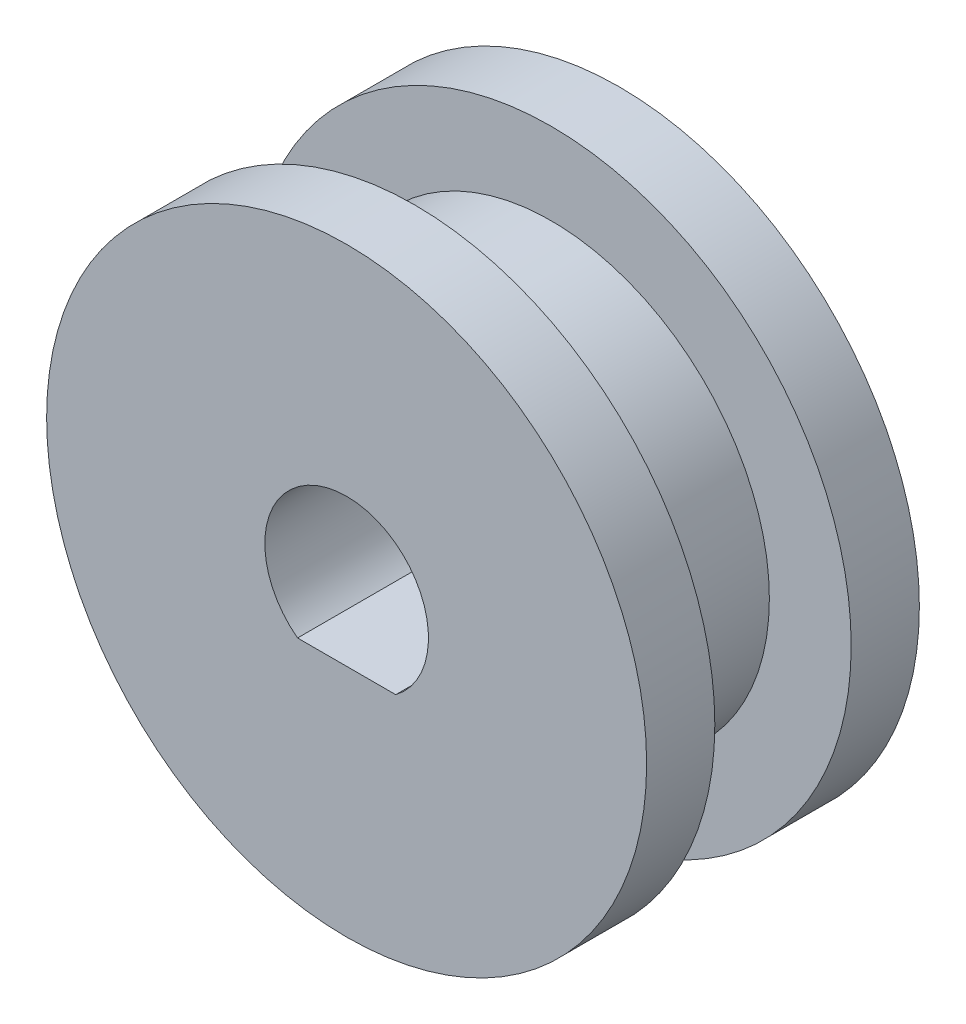
ISO-10303-21;
HEADER;
FILE_DESCRIPTION(('STEP AP214'),'2;1');
FILE_NAME('part.step','',(''),(''),'','','');
FILE_SCHEMA(('AUTOMOTIVE_DESIGN { 1 0 10303 214 1 1 1 1 }'));
ENDSEC;
DATA;
#1=APPLICATION_CONTEXT('core data for automotive mechanical design processes');
#2=APPLICATION_PROTOCOL_DEFINITION('international standard','automotive_design',2000,#1);
#3=PRODUCT_CONTEXT('',#1,'mechanical');
#4=PRODUCT('Part','Part','',(#3));
#5=PRODUCT_RELATED_PRODUCT_CATEGORY('part','',(#4));
#6=PRODUCT_DEFINITION_FORMATION('','',#4);
#7=PRODUCT_DEFINITION_CONTEXT('part definition',#1,'design');
#8=PRODUCT_DEFINITION('design','',#6,#7);
#9=PRODUCT_DEFINITION_SHAPE('','',#8);
#10=(LENGTH_UNIT() NAMED_UNIT(*) SI_UNIT(.MILLI.,.METRE.));
#11=(NAMED_UNIT(*) PLANE_ANGLE_UNIT() SI_UNIT($,.RADIAN.));
#12=(NAMED_UNIT(*) SI_UNIT($,.STERADIAN.) SOLID_ANGLE_UNIT());
#13=UNCERTAINTY_MEASURE_WITH_UNIT(LENGTH_MEASURE(1.E-05),#10,'distance_accuracy_value','');
#14=(GEOMETRIC_REPRESENTATION_CONTEXT(3) GLOBAL_UNCERTAINTY_ASSIGNED_CONTEXT((#13)) GLOBAL_UNIT_ASSIGNED_CONTEXT((#10,
#11,#12)) REPRESENTATION_CONTEXT('',''));
#15=CARTESIAN_POINT('',(0.,0.,0.));
#16=DIRECTION('',(0.,0.,1.));
#17=DIRECTION('',(1.,0.,0.));
#18=AXIS2_PLACEMENT_3D('',#15,#16,#17);
#19=CARTESIAN_POINT('',(0.,0.,10.));
#20=DIRECTION('',(0.,0.,-1.));
#21=DIRECTION('',(-1.,0.,0.));
#22=AXIS2_PLACEMENT_3D('',#19,#20,#21);
#23=CYLINDRICAL_SURFACE('',#22,11.);
#24=CARTESIAN_POINT('',(0.,0.,2.5));
#25=DIRECTION('',(0.,0.,-1.));
#26=DIRECTION('',(-1.,0.,0.));
#27=AXIS2_PLACEMENT_3D('',#24,#25,#26);
#28=CIRCLE('',#27,11.);
#29=CARTESIAN_POINT('',(-11.,0.,2.5));
#30=VERTEX_POINT('',#29);
#31=EDGE_CURVE('E77',#30,#30,#28,.T.);
#32=ORIENTED_EDGE('',*,*,#31,.T.);
#33=EDGE_LOOP('',(#32));
#34=FACE_BOUND('',#33,.T.);
#35=CARTESIAN_POINT('',(0.,0.,0.));
#36=DIRECTION('',(0.,0.,1.));
#37=DIRECTION('',(1.,0.,0.));
#38=AXIS2_PLACEMENT_3D('',#35,#36,#37);
#39=CIRCLE('',#38,11.);
#40=CARTESIAN_POINT('',(11.,0.,0.));
#41=VERTEX_POINT('',#40);
#42=EDGE_CURVE('E80',#41,#41,#39,.T.);
#43=ORIENTED_EDGE('',*,*,#42,.T.);
#44=EDGE_LOOP('',(#43));
#45=FACE_BOUND('',#44,.T.);
#46=ADVANCED_FACE('F43',(#34,#45),#23,.T.);
#47=CARTESIAN_POINT('',(0.,0.,10.));
#48=DIRECTION('',(0.,0.,-1.));
#49=DIRECTION('',(-1.,0.,0.));
#50=AXIS2_PLACEMENT_3D('',#47,#48,#49);
#51=CYLINDRICAL_SURFACE('',#50,3.);
#52=CARTESIAN_POINT('',(0.,0.,0.));
#53=DIRECTION('',(0.,0.,1.));
#54=DIRECTION('',(1.,0.,0.));
#55=AXIS2_PLACEMENT_3D('',#52,#53,#54);
#56=CIRCLE('',#55,3.);
#57=CARTESIAN_POINT('',(1.8,-2.4,0.));
#58=VERTEX_POINT('',#57);
#59=CARTESIAN_POINT('',(-1.8,-2.4,0.));
#60=VERTEX_POINT('',#59);
#61=EDGE_CURVE('E67',#58,#60,#56,.T.);
#62=ORIENTED_EDGE('',*,*,#61,.F.);
#63=DIRECTION('',(0.,0.,-1.));
#64=VECTOR('',#63,1.);
#65=CARTESIAN_POINT('',(1.8,-2.4,10.));
#66=LINE('',#65,#64);
#67=CARTESIAN_POINT('',(1.8,-2.4,10.));
#68=VERTEX_POINT('',#67);
#69=EDGE_CURVE('E11',#68,#58,#66,.T.);
#70=ORIENTED_EDGE('',*,*,#69,.F.);
#71=CARTESIAN_POINT('',(0.,0.,10.));
#72=DIRECTION('',(0.,0.,1.));
#73=DIRECTION('',(1.,0.,0.));
#74=AXIS2_PLACEMENT_3D('',#71,#72,#73);
#75=CIRCLE('',#74,3.);
#76=CARTESIAN_POINT('',(-1.8,-2.4,10.));
#77=VERTEX_POINT('',#76);
#78=EDGE_CURVE('E70',#68,#77,#75,.T.);
#79=ORIENTED_EDGE('',*,*,#78,.T.);
#80=DIRECTION('',(0.,0.,-1.));
#81=VECTOR('',#80,1.);
#82=CARTESIAN_POINT('',(-1.8,-2.4,10.));
#83=LINE('',#82,#81);
#84=EDGE_CURVE('E52',#77,#60,#83,.T.);
#85=ORIENTED_EDGE('',*,*,#84,.T.);
#86=EDGE_LOOP('',(#62,#70,#79,#85));
#87=FACE_BOUND('',#86,.T.);
#88=ADVANCED_FACE('F45',(#87),#51,.F.);
#89=CARTESIAN_POINT('',(0.,-2.4,10.));
#90=DIRECTION('',(0.,1.,0.));
#91=DIRECTION('',(0.,0.,1.));
#92=AXIS2_PLACEMENT_3D('',#89,#90,#91);
#93=PLANE('',#92);
#94=DIRECTION('',(1.,0.,0.));
#95=VECTOR('',#94,1.);
#96=CARTESIAN_POINT('',(0.,-2.4,0.));
#97=LINE('',#96,#95);
#98=EDGE_CURVE('E76',#60,#58,#97,.T.);
#99=ORIENTED_EDGE('',*,*,#98,.F.);
#100=ORIENTED_EDGE('',*,*,#84,.F.);
#101=DIRECTION('',(1.,0.,0.));
#102=VECTOR('',#101,1.);
#103=CARTESIAN_POINT('',(0.,-2.4,10.));
#104=LINE('',#103,#102);
#105=EDGE_CURVE('E87',#77,#68,#104,.T.);
#106=ORIENTED_EDGE('',*,*,#105,.T.);
#107=ORIENTED_EDGE('',*,*,#69,.T.);
#108=EDGE_LOOP('',(#99,#100,#106,#107));
#109=FACE_BOUND('',#108,.T.);
#110=ADVANCED_FACE('F79',(#109),#93,.T.);
#111=CARTESIAN_POINT('',(0.,0.,7.5));
#112=DIRECTION('',(0.,0.,-1.));
#113=DIRECTION('',(-1.,0.,0.));
#114=AXIS2_PLACEMENT_3D('',#111,#112,#113);
#115=CIRCLE('',#114,11.);
#116=CARTESIAN_POINT('',(-11.,0.,7.5));
#117=VERTEX_POINT('',#116);
#118=EDGE_CURVE('E92',#117,#117,#115,.T.);
#119=ORIENTED_EDGE('',*,*,#118,.F.);
#120=EDGE_LOOP('',(#119));
#121=FACE_BOUND('',#120,.T.);
#122=CARTESIAN_POINT('',(0.,0.,10.));
#123=DIRECTION('',(0.,0.,1.));
#124=DIRECTION('',(1.,0.,0.));
#125=AXIS2_PLACEMENT_3D('',#122,#123,#124);
#126=CIRCLE('',#125,11.);
#127=CARTESIAN_POINT('',(11.,0.,10.));
#128=VERTEX_POINT('',#127);
#129=EDGE_CURVE('E72',#128,#128,#126,.T.);
#130=ORIENTED_EDGE('',*,*,#129,.F.);
#131=EDGE_LOOP('',(#130));
#132=FACE_BOUND('',#131,.T.);
#133=ADVANCED_FACE('F116',(#121,#132),#23,.T.);
#134=CARTESIAN_POINT('',(0.,0.,10.));
#135=DIRECTION('',(0.,0.,1.));
#136=DIRECTION('',(1.,0.,0.));
#137=AXIS2_PLACEMENT_3D('',#134,#135,#136);
#138=PLANE('',#137);
#139=ORIENTED_EDGE('',*,*,#78,.F.);
#140=ORIENTED_EDGE('',*,*,#105,.F.);
#141=EDGE_LOOP('',(#139,#140));
#142=FACE_BOUND('',#141,.T.);
#143=ORIENTED_EDGE('',*,*,#129,.T.);
#144=EDGE_LOOP('',(#143));
#145=FACE_BOUND('',#144,.T.);
#146=ADVANCED_FACE('F119',(#142,#145),#138,.T.);
#147=CARTESIAN_POINT('',(0.,0.,0.));
#148=DIRECTION('',(0.,0.,1.));
#149=DIRECTION('',(1.,0.,0.));
#150=AXIS2_PLACEMENT_3D('',#147,#148,#149);
#151=PLANE('',#150);
#152=ORIENTED_EDGE('',*,*,#61,.T.);
#153=ORIENTED_EDGE('',*,*,#98,.T.);
#154=EDGE_LOOP('',(#152,#153));
#155=FACE_BOUND('',#154,.T.);
#156=ORIENTED_EDGE('',*,*,#42,.F.);
#157=EDGE_LOOP('',(#156));
#158=FACE_BOUND('',#157,.T.);
#159=ADVANCED_FACE('F74',(#155,#158),#151,.F.);
#160=CARTESIAN_POINT('',(-8.,0.,2.5));
#161=DIRECTION('',(0.,0.,-1.));
#162=DIRECTION('',(-1.,0.,0.));
#163=AXIS2_PLACEMENT_3D('',#160,#161,#162);
#164=PLANE('',#163);
#165=ORIENTED_EDGE('',*,*,#31,.F.);
#166=EDGE_LOOP('',(#165));
#167=FACE_BOUND('',#166,.T.);
#168=CARTESIAN_POINT('',(0.,0.,2.5));
#169=DIRECTION('',(0.,0.,-1.));
#170=DIRECTION('',(-1.,0.,0.));
#171=AXIS2_PLACEMENT_3D('',#168,#169,#170);
#172=CIRCLE('',#171,8.);
#173=CARTESIAN_POINT('',(-8.,0.,2.5));
#174=VERTEX_POINT('',#173);
#175=EDGE_CURVE('E98',#174,#174,#172,.T.);
#176=ORIENTED_EDGE('',*,*,#175,.T.);
#177=EDGE_LOOP('',(#176));
#178=FACE_BOUND('',#177,.T.);
#179=ADVANCED_FACE('F102',(#167,#178),#164,.F.);
#180=CARTESIAN_POINT('',(-11.,0.,7.5));
#181=DIRECTION('',(0.,0.,1.));
#182=DIRECTION('',(1.,0.,0.));
#183=AXIS2_PLACEMENT_3D('',#180,#181,#182);
#184=PLANE('',#183);
#185=CARTESIAN_POINT('',(0.,0.,7.5));
#186=DIRECTION('',(0.,0.,-1.));
#187=DIRECTION('',(-1.,0.,0.));
#188=AXIS2_PLACEMENT_3D('',#185,#186,#187);
#189=CIRCLE('',#188,8.);
#190=CARTESIAN_POINT('',(-8.,0.,7.5));
#191=VERTEX_POINT('',#190);
#192=EDGE_CURVE('E95',#191,#191,#189,.T.);
#193=ORIENTED_EDGE('',*,*,#192,.F.);
#194=EDGE_LOOP('',(#193));
#195=FACE_BOUND('',#194,.T.);
#196=ORIENTED_EDGE('',*,*,#118,.T.);
#197=EDGE_LOOP('',(#196));
#198=FACE_BOUND('',#197,.T.);
#199=ADVANCED_FACE('F107',(#195,#198),#184,.F.);
#200=CARTESIAN_POINT('',(0.,0.,0.));
#201=DIRECTION('',(0.,0.,-1.));
#202=DIRECTION('',(-1.,0.,0.));
#203=AXIS2_PLACEMENT_3D('',#200,#201,#202);
#204=CYLINDRICAL_SURFACE('',#203,8.);
#205=ORIENTED_EDGE('',*,*,#175,.F.);
#206=EDGE_LOOP('',(#205));
#207=FACE_BOUND('',#206,.T.);
#208=ORIENTED_EDGE('',*,*,#192,.T.);
#209=EDGE_LOOP('',(#208));
#210=FACE_BOUND('',#209,.T.);
#211=ADVANCED_FACE('F104',(#207,#210),#204,.T.);
#212=CLOSED_SHELL('',(#46,#88,#110,#133,#146,#159,#179,#199,#211));
#213=MANIFOLD_SOLID_BREP('B2',#212);
#214=ADVANCED_BREP_SHAPE_REPRESENTATION('',(#18,#213),#14);
#215=SHAPE_DEFINITION_REPRESENTATION(#9,#214);
ENDSEC;
END-ISO-10303-21;
